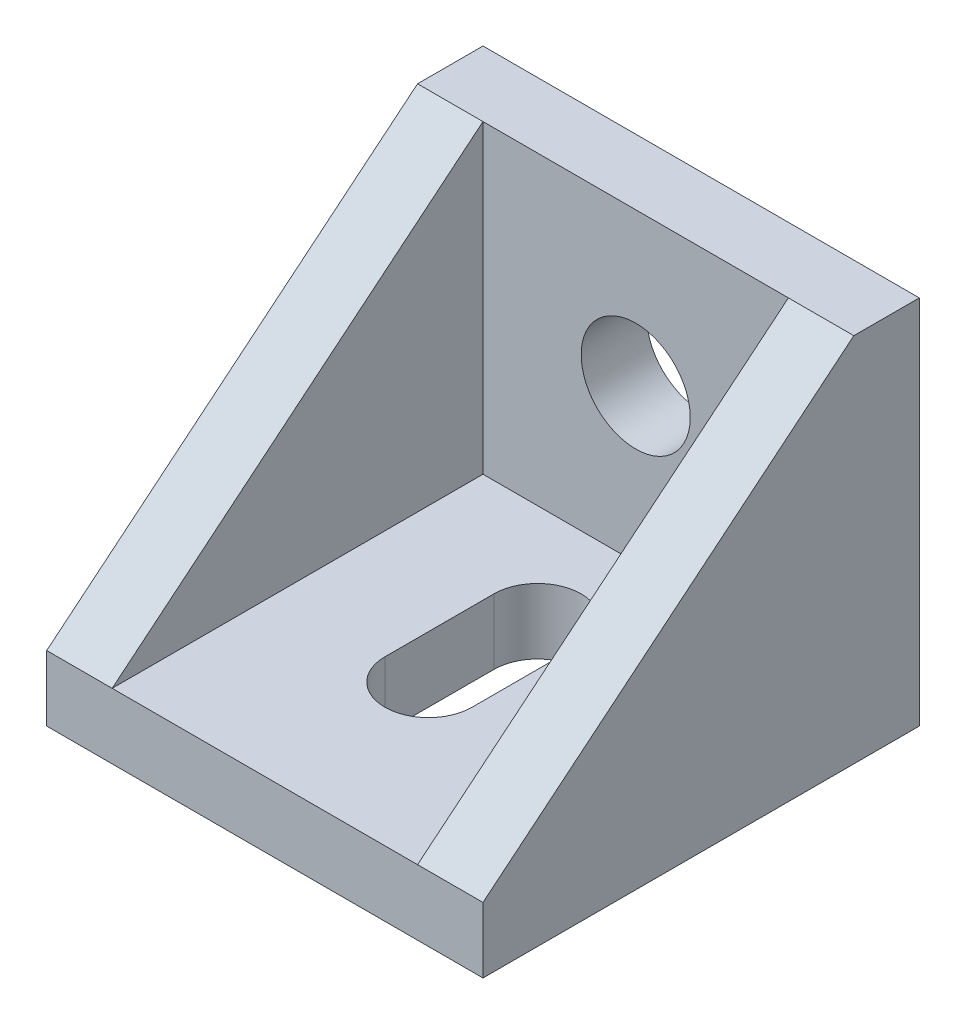
ISO-10303-21;
HEADER;
FILE_DESCRIPTION(('STEP AP214'),'2;1');
FILE_NAME('part.step','',(''),(''),'','','');
FILE_SCHEMA(('AUTOMOTIVE_DESIGN { 1 0 10303 214 1 1 1 1 }'));
ENDSEC;
DATA;
#1=APPLICATION_CONTEXT('core data for automotive mechanical design processes');
#2=APPLICATION_PROTOCOL_DEFINITION('international standard','automotive_design',2000,#1);
#3=PRODUCT_CONTEXT('',#1,'mechanical');
#4=PRODUCT('Part','Part','',(#3));
#5=PRODUCT_RELATED_PRODUCT_CATEGORY('part','',(#4));
#6=PRODUCT_DEFINITION_FORMATION('','',#4);
#7=PRODUCT_DEFINITION_CONTEXT('part definition',#1,'design');
#8=PRODUCT_DEFINITION('design','',#6,#7);
#9=PRODUCT_DEFINITION_SHAPE('','',#8);
#10=(LENGTH_UNIT() NAMED_UNIT(*) SI_UNIT(.MILLI.,.METRE.));
#11=(NAMED_UNIT(*) PLANE_ANGLE_UNIT() SI_UNIT($,.RADIAN.));
#12=(NAMED_UNIT(*) SI_UNIT($,.STERADIAN.) SOLID_ANGLE_UNIT());
#13=UNCERTAINTY_MEASURE_WITH_UNIT(LENGTH_MEASURE(1.E-05),#10,'distance_accuracy_value','');
#14=(GEOMETRIC_REPRESENTATION_CONTEXT(3) GLOBAL_UNCERTAINTY_ASSIGNED_CONTEXT((#13)) GLOBAL_UNIT_ASSIGNED_CONTEXT((#10,
#11,#12)) REPRESENTATION_CONTEXT('',''));
#15=CARTESIAN_POINT('',(0.,0.,0.));
#16=DIRECTION('',(0.,0.,1.));
#17=DIRECTION('',(1.,0.,0.));
#18=AXIS2_PLACEMENT_3D('',#15,#16,#17);
#19=CARTESIAN_POINT('',(0.,3.,0.));
#20=DIRECTION('',(0.,1.,0.));
#21=DIRECTION('',(0.,0.,1.));
#22=AXIS2_PLACEMENT_3D('',#19,#20,#21);
#23=PLANE('',#22);
#24=CARTESIAN_POINT('',(0.,3.,2.5));
#25=DIRECTION('',(0.,1.,0.));
#26=DIRECTION('',(0.,0.,1.));
#27=AXIS2_PLACEMENT_3D('',#24,#25,#26);
#28=CIRCLE('',#27,2.);
#29=CARTESIAN_POINT('',(-2.,3.,2.5));
#30=VERTEX_POINT('',#29);
#31=CARTESIAN_POINT('',(2.,3.,2.5));
#32=VERTEX_POINT('',#31);
#33=EDGE_CURVE('E49',#30,#32,#28,.T.);
#34=ORIENTED_EDGE('',*,*,#33,.F.);
#35=DIRECTION('',(0.,0.,1.));
#36=VECTOR('',#35,1.);
#37=CARTESIAN_POINT('',(-2.,3.,2.5));
#38=LINE('',#37,#36);
#39=CARTESIAN_POINT('',(-2.,3.,-2.5));
#40=VERTEX_POINT('',#39);
#41=EDGE_CURVE('E141',#40,#30,#38,.T.);
#42=ORIENTED_EDGE('',*,*,#41,.F.);
#43=CARTESIAN_POINT('',(0.,3.,-2.5));
#44=DIRECTION('',(0.,1.,0.));
#45=DIRECTION('',(0.,0.,1.));
#46=AXIS2_PLACEMENT_3D('',#43,#44,#45);
#47=CIRCLE('',#46,2.);
#48=CARTESIAN_POINT('',(2.,3.,-2.5));
#49=VERTEX_POINT('',#48);
#50=EDGE_CURVE('E126',#49,#40,#47,.T.);
#51=ORIENTED_EDGE('',*,*,#50,.F.);
#52=DIRECTION('',(0.,0.,-1.));
#53=VECTOR('',#52,1.);
#54=CARTESIAN_POINT('',(2.,3.,2.5));
#55=LINE('',#54,#53);
#56=EDGE_CURVE('E135',#32,#49,#55,.T.);
#57=ORIENTED_EDGE('',*,*,#56,.F.);
#58=EDGE_LOOP('',(#34,#42,#51,#57));
#59=FACE_BOUND('',#58,.T.);
#60=DIRECTION('',(1.,0.,0.));
#61=VECTOR('',#60,1.);
#62=CARTESIAN_POINT('',(0.,3.,-7.));
#63=LINE('',#62,#61);
#64=CARTESIAN_POINT('',(-7.,3.,-7.));
#65=VERTEX_POINT('',#64);
#66=CARTESIAN_POINT('',(7.,3.,-7.));
#67=VERTEX_POINT('',#66);
#68=EDGE_CURVE('E193',#65,#67,#63,.T.);
#69=ORIENTED_EDGE('',*,*,#68,.F.);
#70=DIRECTION('',(0.,0.,-1.));
#71=VECTOR('',#70,1.);
#72=CARTESIAN_POINT('',(-7.,3.,10.));
#73=LINE('',#72,#71);
#74=CARTESIAN_POINT('',(-7.,3.,10.));
#75=VERTEX_POINT('',#74);
#76=EDGE_CURVE('E162',#75,#65,#73,.T.);
#77=ORIENTED_EDGE('',*,*,#76,.F.);
#78=DIRECTION('',(1.,0.,0.));
#79=VECTOR('',#78,1.);
#80=CARTESIAN_POINT('',(10.,3.,10.));
#81=LINE('',#80,#79);
#82=CARTESIAN_POINT('',(7.,3.,10.));
#83=VERTEX_POINT('',#82);
#84=EDGE_CURVE('E202',#75,#83,#81,.T.);
#85=ORIENTED_EDGE('',*,*,#84,.T.);
#86=DIRECTION('',(0.,0.,-1.));
#87=VECTOR('',#86,1.);
#88=CARTESIAN_POINT('',(7.,3.,10.));
#89=LINE('',#88,#87);
#90=EDGE_CURVE('E169',#83,#67,#89,.T.);
#91=ORIENTED_EDGE('',*,*,#90,.T.);
#92=EDGE_LOOP('',(#69,#77,#85,#91));
#93=FACE_BOUND('',#92,.T.);
#94=ADVANCED_FACE('F34',(#59,#93),#23,.T.);
#95=CARTESIAN_POINT('',(0.,0.,-7.));
#96=DIRECTION('',(0.,0.,1.));
#97=DIRECTION('',(1.,0.,0.));
#98=AXIS2_PLACEMENT_3D('',#95,#96,#97);
#99=PLANE('',#98);
#100=CARTESIAN_POINT('',(0.,10.,-7.));
#101=DIRECTION('',(0.,0.,1.));
#102=DIRECTION('',(1.,0.,0.));
#103=AXIS2_PLACEMENT_3D('',#100,#101,#102);
#104=CIRCLE('',#103,2.5);
#105=CARTESIAN_POINT('',(2.5,10.,-7.));
#106=VERTEX_POINT('',#105);
#107=EDGE_CURVE('E148',#106,#106,#104,.T.);
#108=ORIENTED_EDGE('',*,*,#107,.F.);
#109=EDGE_LOOP('',(#108));
#110=FACE_BOUND('',#109,.T.);
#111=DIRECTION('',(1.,0.,0.));
#112=VECTOR('',#111,1.);
#113=CARTESIAN_POINT('',(10.,17.,-7.));
#114=LINE('',#113,#112);
#115=CARTESIAN_POINT('',(-7.,17.,-7.));
#116=VERTEX_POINT('',#115);
#117=CARTESIAN_POINT('',(7.,17.,-7.));
#118=VERTEX_POINT('',#117);
#119=EDGE_CURVE('E187',#116,#118,#114,.T.);
#120=ORIENTED_EDGE('',*,*,#119,.F.);
#121=DIRECTION('',(0.,1.,0.));
#122=VECTOR('',#121,1.);
#123=CARTESIAN_POINT('',(-7.,17.,-7.));
#124=LINE('',#123,#122);
#125=EDGE_CURVE('E159',#65,#116,#124,.T.);
#126=ORIENTED_EDGE('',*,*,#125,.F.);
#127=ORIENTED_EDGE('',*,*,#68,.T.);
#128=DIRECTION('',(0.,1.,0.));
#129=VECTOR('',#128,1.);
#130=CARTESIAN_POINT('',(7.,17.,-7.));
#131=LINE('',#130,#129);
#132=EDGE_CURVE('E172',#67,#118,#131,.T.);
#133=ORIENTED_EDGE('',*,*,#132,.T.);
#134=EDGE_LOOP('',(#120,#126,#127,#133));
#135=FACE_BOUND('',#134,.T.);
#136=ADVANCED_FACE('F244',(#110,#135),#99,.T.);
#137=CARTESIAN_POINT('',(-10.,3.,10.));
#138=DIRECTION('',(1.,0.,0.));
#139=DIRECTION('',(0.,0.,-1.));
#140=AXIS2_PLACEMENT_3D('',#137,#138,#139);
#141=PLANE('',#140);
#142=DIRECTION('',(0.,-1.,0.));
#143=VECTOR('',#142,1.);
#144=CARTESIAN_POINT('',(-10.,3.,10.));
#145=LINE('',#144,#143);
#146=CARTESIAN_POINT('',(-10.,3.,10.));
#147=VERTEX_POINT('',#146);
#148=CARTESIAN_POINT('',(-10.,0.,10.));
#149=VERTEX_POINT('',#148);
#150=EDGE_CURVE('E218',#147,#149,#145,.T.);
#151=ORIENTED_EDGE('',*,*,#150,.F.);
#152=DIRECTION('',(0.,-0.6357072528611,0.77193023561705));
#153=VECTOR('',#152,1.);
#154=CARTESIAN_POINT('',(-10.,17.,-7.));
#155=LINE('',#154,#153);
#156=CARTESIAN_POINT('',(-10.,17.,-7.));
#157=VERTEX_POINT('',#156);
#158=EDGE_CURVE('E154',#157,#147,#155,.T.);
#159=ORIENTED_EDGE('',*,*,#158,.F.);
#160=DIRECTION('',(0.,0.,-1.));
#161=VECTOR('',#160,1.);
#162=CARTESIAN_POINT('',(-10.,17.,-7.));
#163=LINE('',#162,#161);
#164=CARTESIAN_POINT('',(-10.,17.,-10.));
#165=VERTEX_POINT('',#164);
#166=EDGE_CURVE('E186',#157,#165,#163,.T.);
#167=ORIENTED_EDGE('',*,*,#166,.T.);
#168=DIRECTION('',(0.,-1.,0.));
#169=VECTOR('',#168,1.);
#170=CARTESIAN_POINT('',(-10.,3.,-10.));
#171=LINE('',#170,#169);
#172=CARTESIAN_POINT('',(-10.,0.,-10.));
#173=VERTEX_POINT('',#172);
#174=EDGE_CURVE('E201',#165,#173,#171,.T.);
#175=ORIENTED_EDGE('',*,*,#174,.T.);
#176=DIRECTION('',(0.,0.,1.));
#177=VECTOR('',#176,1.);
#178=CARTESIAN_POINT('',(-10.,0.,10.));
#179=LINE('',#178,#177);
#180=EDGE_CURVE('E197',#173,#149,#179,.T.);
#181=ORIENTED_EDGE('',*,*,#180,.T.);
#182=EDGE_LOOP('',(#151,#159,#167,#175,#181));
#183=FACE_BOUND('',#182,.T.);
#184=ADVANCED_FACE('F36',(#183),#141,.F.);
#185=CARTESIAN_POINT('',(10.,3.,10.));
#186=DIRECTION('',(0.,0.,-1.));
#187=DIRECTION('',(-1.,0.,0.));
#188=AXIS2_PLACEMENT_3D('',#185,#186,#187);
#189=PLANE('',#188);
#190=DIRECTION('',(1.,0.,0.));
#191=VECTOR('',#190,1.);
#192=CARTESIAN_POINT('',(10.,0.,10.));
#193=LINE('',#192,#191);
#194=CARTESIAN_POINT('',(10.,0.,10.));
#195=VERTEX_POINT('',#194);
#196=EDGE_CURVE('E204',#149,#195,#193,.T.);
#197=ORIENTED_EDGE('',*,*,#196,.T.);
#198=DIRECTION('',(0.,-1.,0.));
#199=VECTOR('',#198,1.);
#200=CARTESIAN_POINT('',(10.,3.,10.));
#201=LINE('',#200,#199);
#202=CARTESIAN_POINT('',(10.,3.,10.));
#203=VERTEX_POINT('',#202);
#204=EDGE_CURVE('E215',#203,#195,#201,.T.);
#205=ORIENTED_EDGE('',*,*,#204,.F.);
#206=DIRECTION('',(1.,0.,0.));
#207=VECTOR('',#206,1.);
#208=CARTESIAN_POINT('',(7.,3.,10.));
#209=LINE('',#208,#207);
#210=EDGE_CURVE('E175',#83,#203,#209,.T.);
#211=ORIENTED_EDGE('',*,*,#210,.F.);
#212=ORIENTED_EDGE('',*,*,#84,.F.);
#213=EDGE_CURVE('E198',#147,#75,#81,.T.);
#214=ORIENTED_EDGE('',*,*,#213,.F.);
#215=ORIENTED_EDGE('',*,*,#150,.T.);
#216=EDGE_LOOP('',(#197,#205,#211,#212,#214,#215));
#217=FACE_BOUND('',#216,.T.);
#218=ADVANCED_FACE('F262',(#217),#189,.F.);
#219=CARTESIAN_POINT('',(10.,3.,10.));
#220=DIRECTION('',(-1.,0.,0.));
#221=DIRECTION('',(0.,0.,1.));
#222=AXIS2_PLACEMENT_3D('',#219,#220,#221);
#223=PLANE('',#222);
#224=DIRECTION('',(0.,0.,-1.));
#225=VECTOR('',#224,1.);
#226=CARTESIAN_POINT('',(10.,0.,10.));
#227=LINE('',#226,#225);
#228=CARTESIAN_POINT('',(10.,0.,-10.));
#229=VERTEX_POINT('',#228);
#230=EDGE_CURVE('E206',#195,#229,#227,.T.);
#231=ORIENTED_EDGE('',*,*,#230,.T.);
#232=DIRECTION('',(0.,-1.,0.));
#233=VECTOR('',#232,1.);
#234=CARTESIAN_POINT('',(10.,3.,-10.));
#235=LINE('',#234,#233);
#236=CARTESIAN_POINT('',(10.,17.,-10.));
#237=VERTEX_POINT('',#236);
#238=EDGE_CURVE('E212',#237,#229,#235,.T.);
#239=ORIENTED_EDGE('',*,*,#238,.F.);
#240=DIRECTION('',(0.,0.,-1.));
#241=VECTOR('',#240,1.);
#242=CARTESIAN_POINT('',(10.,17.,-7.));
#243=LINE('',#242,#241);
#244=CARTESIAN_POINT('',(10.,17.,-7.));
#245=VERTEX_POINT('',#244);
#246=EDGE_CURVE('E190',#245,#237,#243,.T.);
#247=ORIENTED_EDGE('',*,*,#246,.F.);
#248=DIRECTION('',(0.,-0.6357072528611,0.77193023561705));
#249=VECTOR('',#248,1.);
#250=CARTESIAN_POINT('',(10.,17.,-7.));
#251=LINE('',#250,#249);
#252=EDGE_CURVE('E164',#245,#203,#251,.T.);
#253=ORIENTED_EDGE('',*,*,#252,.T.);
#254=ORIENTED_EDGE('',*,*,#204,.T.);
#255=EDGE_LOOP('',(#231,#239,#247,#253,#254));
#256=FACE_BOUND('',#255,.T.);
#257=ADVANCED_FACE('F259',(#256),#223,.F.);
#258=CARTESIAN_POINT('',(10.,3.,-10.));
#259=DIRECTION('',(0.,0.,1.));
#260=DIRECTION('',(1.,0.,0.));
#261=AXIS2_PLACEMENT_3D('',#258,#259,#260);
#262=PLANE('',#261);
#263=CARTESIAN_POINT('',(0.,10.,-10.));
#264=DIRECTION('',(0.,0.,1.));
#265=DIRECTION('',(1.,0.,0.));
#266=AXIS2_PLACEMENT_3D('',#263,#264,#265);
#267=CIRCLE('',#266,2.5);
#268=CARTESIAN_POINT('',(2.5,10.,-10.));
#269=VERTEX_POINT('',#268);
#270=EDGE_CURVE('E151',#269,#269,#267,.T.);
#271=ORIENTED_EDGE('',*,*,#270,.T.);
#272=EDGE_LOOP('',(#271));
#273=FACE_BOUND('',#272,.T.);
#274=DIRECTION('',(-1.,0.,0.));
#275=VECTOR('',#274,1.);
#276=CARTESIAN_POINT('',(10.,0.,-10.));
#277=LINE('',#276,#275);
#278=EDGE_CURVE('E208',#229,#173,#277,.T.);
#279=ORIENTED_EDGE('',*,*,#278,.T.);
#280=ORIENTED_EDGE('',*,*,#174,.F.);
#281=DIRECTION('',(1.,0.,0.));
#282=VECTOR('',#281,1.);
#283=CARTESIAN_POINT('',(10.,17.,-10.));
#284=LINE('',#283,#282);
#285=EDGE_CURVE('E181',#165,#237,#284,.T.);
#286=ORIENTED_EDGE('',*,*,#285,.T.);
#287=ORIENTED_EDGE('',*,*,#238,.T.);
#288=EDGE_LOOP('',(#279,#280,#286,#287));
#289=FACE_BOUND('',#288,.T.);
#290=ADVANCED_FACE('F256',(#273,#289),#262,.F.);
#291=CARTESIAN_POINT('',(0.,0.,0.));
#292=DIRECTION('',(0.,1.,0.));
#293=DIRECTION('',(0.,0.,1.));
#294=AXIS2_PLACEMENT_3D('',#291,#292,#293);
#295=PLANE('',#294);
#296=DIRECTION('',(0.,0.,1.));
#297=VECTOR('',#296,1.);
#298=CARTESIAN_POINT('',(-2.,0.,0.));
#299=LINE('',#298,#297);
#300=CARTESIAN_POINT('',(-2.,0.,-2.5));
#301=VERTEX_POINT('',#300);
#302=CARTESIAN_POINT('',(-2.,0.,2.5));
#303=VERTEX_POINT('',#302);
#304=EDGE_CURVE('E42',#301,#303,#299,.T.);
#305=ORIENTED_EDGE('',*,*,#304,.T.);
#306=CARTESIAN_POINT('',(0.,0.,2.5));
#307=DIRECTION('',(0.,1.,0.));
#308=DIRECTION('',(0.,0.,1.));
#309=AXIS2_PLACEMENT_3D('',#306,#307,#308);
#310=CIRCLE('',#309,2.);
#311=CARTESIAN_POINT('',(2.,0.,2.5));
#312=VERTEX_POINT('',#311);
#313=EDGE_CURVE('E11',#303,#312,#310,.T.);
#314=ORIENTED_EDGE('',*,*,#313,.T.);
#315=DIRECTION('',(0.,0.,-1.));
#316=VECTOR('',#315,1.);
#317=CARTESIAN_POINT('',(2.,0.,0.));
#318=LINE('',#317,#316);
#319=CARTESIAN_POINT('',(2.,0.,-2.5));
#320=VERTEX_POINT('',#319);
#321=EDGE_CURVE('E221',#312,#320,#318,.T.);
#322=ORIENTED_EDGE('',*,*,#321,.T.);
#323=CARTESIAN_POINT('',(0.,0.,-2.5));
#324=DIRECTION('',(0.,1.,0.));
#325=DIRECTION('',(0.,0.,1.));
#326=AXIS2_PLACEMENT_3D('',#323,#324,#325);
#327=CIRCLE('',#326,2.);
#328=EDGE_CURVE('E129',#320,#301,#327,.T.);
#329=ORIENTED_EDGE('',*,*,#328,.T.);
#330=EDGE_LOOP('',(#305,#314,#322,#329));
#331=FACE_BOUND('',#330,.T.);
#332=ORIENTED_EDGE('',*,*,#196,.F.);
#333=ORIENTED_EDGE('',*,*,#180,.F.);
#334=ORIENTED_EDGE('',*,*,#278,.F.);
#335=ORIENTED_EDGE('',*,*,#230,.F.);
#336=EDGE_LOOP('',(#332,#333,#334,#335));
#337=FACE_BOUND('',#336,.T.);
#338=ADVANCED_FACE('F225',(#331,#337),#295,.F.);
#339=CARTESIAN_POINT('',(10.,17.,-7.));
#340=DIRECTION('',(0.,1.,0.));
#341=DIRECTION('',(0.,0.,1.));
#342=AXIS2_PLACEMENT_3D('',#339,#340,#341);
#343=PLANE('',#342);
#344=ORIENTED_EDGE('',*,*,#285,.F.);
#345=ORIENTED_EDGE('',*,*,#166,.F.);
#346=EDGE_CURVE('E183',#157,#116,#114,.T.);
#347=ORIENTED_EDGE('',*,*,#346,.T.);
#348=ORIENTED_EDGE('',*,*,#119,.T.);
#349=DIRECTION('',(1.,0.,0.));
#350=VECTOR('',#349,1.);
#351=CARTESIAN_POINT('',(7.,17.,-7.));
#352=LINE('',#351,#350);
#353=EDGE_CURVE('E178',#118,#245,#352,.T.);
#354=ORIENTED_EDGE('',*,*,#353,.T.);
#355=ORIENTED_EDGE('',*,*,#246,.T.);
#356=EDGE_LOOP('',(#344,#345,#347,#348,#354,#355));
#357=FACE_BOUND('',#356,.T.);
#358=ADVANCED_FACE('F253',(#357),#343,.T.);
#359=CARTESIAN_POINT('',(7.,17.,-7.));
#360=DIRECTION('',(0.,0.77193023561705,0.6357072528611));
#361=DIRECTION('',(0.,-0.6357072528611,0.77193023561705));
#362=AXIS2_PLACEMENT_3D('',#359,#360,#361);
#363=PLANE('',#362);
#364=ORIENTED_EDGE('',*,*,#252,.F.);
#365=ORIENTED_EDGE('',*,*,#353,.F.);
#366=DIRECTION('',(0.,-0.6357072528611,0.77193023561705));
#367=VECTOR('',#366,1.);
#368=CARTESIAN_POINT('',(7.,17.,-7.));
#369=LINE('',#368,#367);
#370=EDGE_CURVE('E166',#118,#83,#369,.T.);
#371=ORIENTED_EDGE('',*,*,#370,.T.);
#372=ORIENTED_EDGE('',*,*,#210,.T.);
#373=EDGE_LOOP('',(#364,#365,#371,#372));
#374=FACE_BOUND('',#373,.T.);
#375=ADVANCED_FACE('F288',(#374),#363,.T.);
#376=CARTESIAN_POINT('',(7.,0.,0.));
#377=DIRECTION('',(1.,0.,0.));
#378=DIRECTION('',(0.,0.,-1.));
#379=AXIS2_PLACEMENT_3D('',#376,#377,#378);
#380=PLANE('',#379);
#381=ORIENTED_EDGE('',*,*,#370,.F.);
#382=ORIENTED_EDGE('',*,*,#132,.F.);
#383=ORIENTED_EDGE('',*,*,#90,.F.);
#384=EDGE_LOOP('',(#381,#382,#383));
#385=FACE_BOUND('',#384,.T.);
#386=ADVANCED_FACE('F292',(#385),#380,.F.);
#387=CARTESIAN_POINT('',(-7.,17.,-7.));
#388=DIRECTION('',(0.,-0.77193023561705,-0.6357072528611));
#389=DIRECTION('',(0.,0.6357072528611,-0.77193023561705));
#390=AXIS2_PLACEMENT_3D('',#387,#388,#389);
#391=PLANE('',#390);
#392=ORIENTED_EDGE('',*,*,#158,.T.);
#393=ORIENTED_EDGE('',*,*,#213,.T.);
#394=DIRECTION('',(0.,-0.6357072528611,0.77193023561705));
#395=VECTOR('',#394,1.);
#396=CARTESIAN_POINT('',(-7.,17.,-7.));
#397=LINE('',#396,#395);
#398=EDGE_CURVE('E157',#116,#75,#397,.T.);
#399=ORIENTED_EDGE('',*,*,#398,.F.);
#400=ORIENTED_EDGE('',*,*,#346,.F.);
#401=EDGE_LOOP('',(#392,#393,#399,#400));
#402=FACE_BOUND('',#401,.T.);
#403=ADVANCED_FACE('F299',(#402),#391,.F.);
#404=CARTESIAN_POINT('',(-7.,0.,0.));
#405=DIRECTION('',(-1.,0.,0.));
#406=DIRECTION('',(0.,0.,-1.));
#407=AXIS2_PLACEMENT_3D('',#404,#405,#406);
#408=PLANE('',#407);
#409=ORIENTED_EDGE('',*,*,#398,.T.);
#410=ORIENTED_EDGE('',*,*,#76,.T.);
#411=ORIENTED_EDGE('',*,*,#125,.T.);
#412=EDGE_LOOP('',(#409,#410,#411));
#413=FACE_BOUND('',#412,.T.);
#414=ADVANCED_FACE('F239',(#413),#408,.F.);
#415=CARTESIAN_POINT('',(0.,10.,-10.));
#416=DIRECTION('',(0.,0.,1.));
#417=DIRECTION('',(1.,0.,0.));
#418=AXIS2_PLACEMENT_3D('',#415,#416,#417);
#419=CYLINDRICAL_SURFACE('',#418,2.5);
#420=ORIENTED_EDGE('',*,*,#270,.F.);
#421=EDGE_LOOP('',(#420));
#422=FACE_BOUND('',#421,.T.);
#423=ORIENTED_EDGE('',*,*,#107,.T.);
#424=EDGE_LOOP('',(#423));
#425=FACE_BOUND('',#424,.T.);
#426=ADVANCED_FACE('F232',(#422,#425),#419,.F.);
#427=CARTESIAN_POINT('',(0.,-1.,2.5));
#428=DIRECTION('',(0.,1.,0.));
#429=DIRECTION('',(0.,0.,1.));
#430=AXIS2_PLACEMENT_3D('',#427,#428,#429);
#431=CYLINDRICAL_SURFACE('',#430,2.);
#432=DIRECTION('',(0.,1.,0.));
#433=VECTOR('',#432,1.);
#434=CARTESIAN_POINT('',(-2.,-1.,2.5));
#435=LINE('',#434,#433);
#436=EDGE_CURVE('E146',#303,#30,#435,.T.);
#437=ORIENTED_EDGE('',*,*,#436,.T.);
#438=ORIENTED_EDGE('',*,*,#33,.T.);
#439=DIRECTION('',(0.,1.,0.));
#440=VECTOR('',#439,1.);
#441=CARTESIAN_POINT('',(2.,-1.,2.5));
#442=LINE('',#441,#440);
#443=EDGE_CURVE('E132',#312,#32,#442,.T.);
#444=ORIENTED_EDGE('',*,*,#443,.F.);
#445=ORIENTED_EDGE('',*,*,#313,.F.);
#446=EDGE_LOOP('',(#437,#438,#444,#445));
#447=FACE_BOUND('',#446,.T.);
#448=ADVANCED_FACE('F230',(#447),#431,.F.);
#449=CARTESIAN_POINT('',(-2.,-1.,2.5));
#450=DIRECTION('',(-1.,0.,0.));
#451=DIRECTION('',(0.,0.,1.));
#452=AXIS2_PLACEMENT_3D('',#449,#450,#451);
#453=PLANE('',#452);
#454=DIRECTION('',(0.,1.,0.));
#455=VECTOR('',#454,1.);
#456=CARTESIAN_POINT('',(-2.,-1.,-2.5));
#457=LINE('',#456,#455);
#458=EDGE_CURVE('E131',#301,#40,#457,.T.);
#459=ORIENTED_EDGE('',*,*,#458,.T.);
#460=ORIENTED_EDGE('',*,*,#41,.T.);
#461=ORIENTED_EDGE('',*,*,#436,.F.);
#462=ORIENTED_EDGE('',*,*,#304,.F.);
#463=EDGE_LOOP('',(#459,#460,#461,#462));
#464=FACE_BOUND('',#463,.T.);
#465=ADVANCED_FACE('F229',(#464),#453,.F.);
#466=CARTESIAN_POINT('',(0.,-1.,-2.5));
#467=DIRECTION('',(0.,1.,0.));
#468=DIRECTION('',(0.,0.,1.));
#469=AXIS2_PLACEMENT_3D('',#466,#467,#468);
#470=CYLINDRICAL_SURFACE('',#469,2.);
#471=DIRECTION('',(0.,1.,0.));
#472=VECTOR('',#471,1.);
#473=CARTESIAN_POINT('',(2.,-1.,-2.5));
#474=LINE('',#473,#472);
#475=EDGE_CURVE('E57',#320,#49,#474,.T.);
#476=ORIENTED_EDGE('',*,*,#475,.T.);
#477=ORIENTED_EDGE('',*,*,#50,.T.);
#478=ORIENTED_EDGE('',*,*,#458,.F.);
#479=ORIENTED_EDGE('',*,*,#328,.F.);
#480=EDGE_LOOP('',(#476,#477,#478,#479));
#481=FACE_BOUND('',#480,.T.);
#482=ADVANCED_FACE('F123',(#481),#470,.F.);
#483=CARTESIAN_POINT('',(2.,-1.,2.5));
#484=DIRECTION('',(1.,0.,0.));
#485=DIRECTION('',(0.,0.,-1.));
#486=AXIS2_PLACEMENT_3D('',#483,#484,#485);
#487=PLANE('',#486);
#488=ORIENTED_EDGE('',*,*,#443,.T.);
#489=ORIENTED_EDGE('',*,*,#56,.T.);
#490=ORIENTED_EDGE('',*,*,#475,.F.);
#491=ORIENTED_EDGE('',*,*,#321,.F.);
#492=EDGE_LOOP('',(#488,#489,#490,#491));
#493=FACE_BOUND('',#492,.T.);
#494=ADVANCED_FACE('F136',(#493),#487,.F.);
#495=CLOSED_SHELL('',(#94,#136,#184,#218,#257,#290,#338,#358,#375,#386,#403,#414,#426,#448,#465,
#482,#494));
#496=MANIFOLD_SOLID_BREP('B2',#495);
#497=ADVANCED_BREP_SHAPE_REPRESENTATION('',(#18,#496),#14);
#498=SHAPE_DEFINITION_REPRESENTATION(#9,#497);
ENDSEC;
END-ISO-10303-21;
